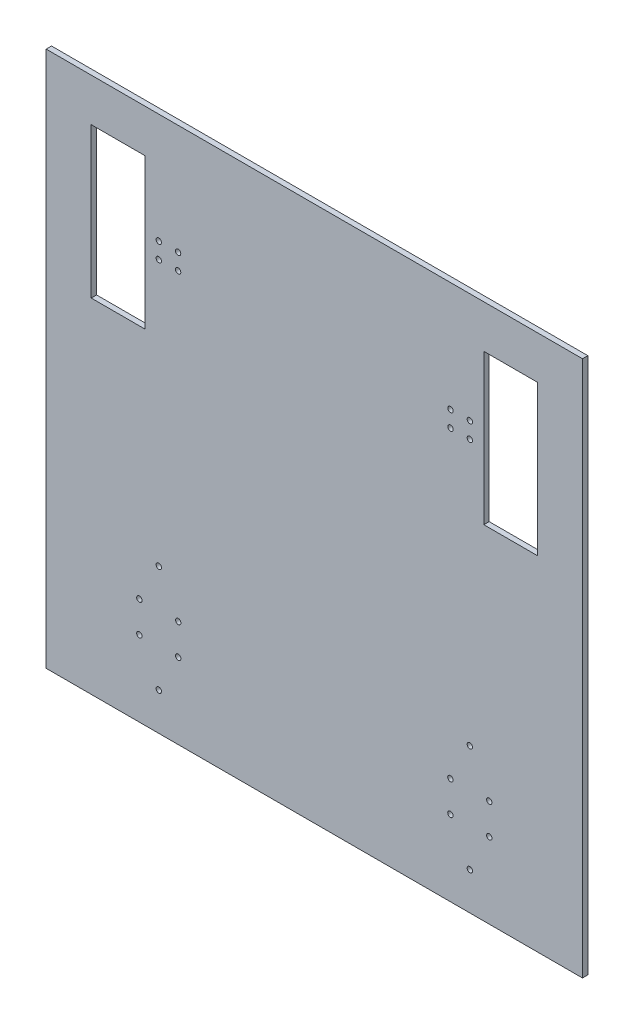
ISO-10303-21;
HEADER;
FILE_DESCRIPTION(('STEP AP214'),'2;1');
FILE_NAME('part.step','',(''),(''),'','','');
FILE_SCHEMA(('AUTOMOTIVE_DESIGN { 1 0 10303 214 1 1 1 1 }'));
ENDSEC;
DATA;
#1=APPLICATION_CONTEXT('core data for automotive mechanical design processes');
#2=APPLICATION_PROTOCOL_DEFINITION('international standard','automotive_design',2000,#1);
#3=PRODUCT_CONTEXT('',#1,'mechanical');
#4=PRODUCT('Part','Part','',(#3));
#5=PRODUCT_RELATED_PRODUCT_CATEGORY('part','',(#4));
#6=PRODUCT_DEFINITION_FORMATION('','',#4);
#7=PRODUCT_DEFINITION_CONTEXT('part definition',#1,'design');
#8=PRODUCT_DEFINITION('design','',#6,#7);
#9=PRODUCT_DEFINITION_SHAPE('','',#8);
#10=(LENGTH_UNIT() NAMED_UNIT(*) SI_UNIT(.MILLI.,.METRE.));
#11=(NAMED_UNIT(*) PLANE_ANGLE_UNIT() SI_UNIT($,.RADIAN.));
#12=(NAMED_UNIT(*) SI_UNIT($,.STERADIAN.) SOLID_ANGLE_UNIT());
#13=UNCERTAINTY_MEASURE_WITH_UNIT(LENGTH_MEASURE(1.E-05),#10,'distance_accuracy_value','');
#14=(GEOMETRIC_REPRESENTATION_CONTEXT(3) GLOBAL_UNCERTAINTY_ASSIGNED_CONTEXT((#13)) GLOBAL_UNIT_ASSIGNED_CONTEXT((#10,
#11,#12)) REPRESENTATION_CONTEXT('',''));
#15=CARTESIAN_POINT('',(0.,0.,0.));
#16=DIRECTION('',(0.,0.,1.));
#17=DIRECTION('',(1.,0.,0.));
#18=AXIS2_PLACEMENT_3D('',#15,#16,#17);
#19=CARTESIAN_POINT('',(-208.,0.,5.));
#20=DIRECTION('',(1.,0.,0.));
#21=DIRECTION('',(0.,0.,-1.));
#22=AXIS2_PLACEMENT_3D('',#19,#20,#21);
#23=PLANE('',#22);
#24=DIRECTION('',(0.,-1.,0.));
#25=VECTOR('',#24,1.);
#26=CARTESIAN_POINT('',(-208.,0.,0.));
#27=LINE('',#26,#25);
#28=CARTESIAN_POINT('',(-208.,210.,0.));
#29=VERTEX_POINT('',#28);
#30=CARTESIAN_POINT('',(-208.,70.,0.));
#31=VERTEX_POINT('',#30);
#32=EDGE_CURVE('E211',#29,#31,#27,.T.);
#33=ORIENTED_EDGE('',*,*,#32,.F.);
#34=DIRECTION('',(0.,0.,-1.));
#35=VECTOR('',#34,1.);
#36=CARTESIAN_POINT('',(-208.,210.,5.));
#37=LINE('',#36,#35);
#38=CARTESIAN_POINT('',(-208.,210.,5.));
#39=VERTEX_POINT('',#38);
#40=EDGE_CURVE('E11',#39,#29,#37,.T.);
#41=ORIENTED_EDGE('',*,*,#40,.F.);
#42=DIRECTION('',(0.,-1.,0.));
#43=VECTOR('',#42,1.);
#44=CARTESIAN_POINT('',(-208.,0.,5.));
#45=LINE('',#44,#43);
#46=CARTESIAN_POINT('',(-208.,70.,5.));
#47=VERTEX_POINT('',#46);
#48=EDGE_CURVE('E145',#39,#47,#45,.T.);
#49=ORIENTED_EDGE('',*,*,#48,.T.);
#50=DIRECTION('',(0.,0.,-1.));
#51=VECTOR('',#50,1.);
#52=CARTESIAN_POINT('',(-208.,70.,5.));
#53=LINE('',#52,#51);
#54=EDGE_CURVE('E54',#47,#31,#53,.T.);
#55=ORIENTED_EDGE('',*,*,#54,.T.);
#56=EDGE_LOOP('',(#33,#41,#49,#55));
#57=FACE_BOUND('',#56,.T.);
#58=ADVANCED_FACE('F35',(#57),#23,.T.);
#59=CARTESIAN_POINT('',(-1.16573417585641E-13,210.,5.));
#60=DIRECTION('',(0.,1.,0.));
#61=DIRECTION('',(-1.,0.,0.));
#62=AXIS2_PLACEMENT_3D('',#59,#60,#61);
#63=PLANE('',#62);
#64=DIRECTION('',(1.,0.,0.));
#65=VECTOR('',#64,1.);
#66=CARTESIAN_POINT('',(-1.16573417585641E-13,210.,0.));
#67=LINE('',#66,#65);
#68=CARTESIAN_POINT('',(-158.,210.,0.));
#69=VERTEX_POINT('',#68);
#70=EDGE_CURVE('E150',#29,#69,#67,.T.);
#71=ORIENTED_EDGE('',*,*,#70,.T.);
#72=DIRECTION('',(0.,0.,-1.));
#73=VECTOR('',#72,1.);
#74=CARTESIAN_POINT('',(-158.,210.,5.));
#75=LINE('',#74,#73);
#76=CARTESIAN_POINT('',(-158.,210.,5.));
#77=VERTEX_POINT('',#76);
#78=EDGE_CURVE('E45',#77,#69,#75,.T.);
#79=ORIENTED_EDGE('',*,*,#78,.F.);
#80=DIRECTION('',(1.,0.,0.));
#81=VECTOR('',#80,1.);
#82=CARTESIAN_POINT('',(-1.16573417585641E-13,210.,5.));
#83=LINE('',#82,#81);
#84=EDGE_CURVE('E139',#39,#77,#83,.T.);
#85=ORIENTED_EDGE('',*,*,#84,.F.);
#86=ORIENTED_EDGE('',*,*,#40,.T.);
#87=EDGE_LOOP('',(#71,#79,#85,#86));
#88=FACE_BOUND('',#87,.T.);
#89=ADVANCED_FACE('F148',(#88),#63,.F.);
#90=CARTESIAN_POINT('',(-158.,0.,5.));
#91=DIRECTION('',(1.,0.,0.));
#92=DIRECTION('',(0.,0.,-1.));
#93=AXIS2_PLACEMENT_3D('',#90,#91,#92);
#94=PLANE('',#93);
#95=DIRECTION('',(0.,-1.,0.));
#96=VECTOR('',#95,1.);
#97=CARTESIAN_POINT('',(-158.,0.,0.));
#98=LINE('',#97,#96);
#99=CARTESIAN_POINT('',(-158.,69.9999999999999,0.));
#100=VERTEX_POINT('',#99);
#101=EDGE_CURVE('E214',#69,#100,#98,.T.);
#102=ORIENTED_EDGE('',*,*,#101,.T.);
#103=DIRECTION('',(0.,0.,-1.));
#104=VECTOR('',#103,1.);
#105=CARTESIAN_POINT('',(-158.,69.9999999999999,5.));
#106=LINE('',#105,#104);
#107=CARTESIAN_POINT('',(-158.,69.9999999999999,5.));
#108=VERTEX_POINT('',#107);
#109=EDGE_CURVE('E92',#108,#100,#106,.T.);
#110=ORIENTED_EDGE('',*,*,#109,.F.);
#111=DIRECTION('',(0.,-1.,0.));
#112=VECTOR('',#111,1.);
#113=CARTESIAN_POINT('',(-158.,0.,5.));
#114=LINE('',#113,#112);
#115=EDGE_CURVE('E131',#77,#108,#114,.T.);
#116=ORIENTED_EDGE('',*,*,#115,.F.);
#117=ORIENTED_EDGE('',*,*,#78,.T.);
#118=EDGE_LOOP('',(#102,#110,#116,#117));
#119=FACE_BOUND('',#118,.T.);
#120=ADVANCED_FACE('F133',(#119),#94,.F.);
#121=CARTESIAN_POINT('',(250.,0.,5.));
#122=DIRECTION('',(-1.,0.,0.));
#123=DIRECTION('',(0.,0.,1.));
#124=AXIS2_PLACEMENT_3D('',#121,#122,#123);
#125=PLANE('',#124);
#126=DIRECTION('',(0.,1.,0.));
#127=VECTOR('',#126,1.);
#128=CARTESIAN_POINT('',(250.,0.,0.));
#129=LINE('',#128,#127);
#130=CARTESIAN_POINT('',(250.,-250.,0.));
#131=VERTEX_POINT('',#130);
#132=CARTESIAN_POINT('',(250.,250.,0.));
#133=VERTEX_POINT('',#132);
#134=EDGE_CURVE('E202',#131,#133,#129,.T.);
#135=ORIENTED_EDGE('',*,*,#134,.T.);
#136=DIRECTION('',(0.,0.,-1.));
#137=VECTOR('',#136,1.);
#138=CARTESIAN_POINT('',(250.,250.,5.));
#139=LINE('',#138,#137);
#140=CARTESIAN_POINT('',(250.,250.,5.));
#141=VERTEX_POINT('',#140);
#142=EDGE_CURVE('E164',#141,#133,#139,.T.);
#143=ORIENTED_EDGE('',*,*,#142,.F.);
#144=DIRECTION('',(0.,1.,0.));
#145=VECTOR('',#144,1.);
#146=CARTESIAN_POINT('',(250.,0.,5.));
#147=LINE('',#146,#145);
#148=CARTESIAN_POINT('',(250.,-250.,5.));
#149=VERTEX_POINT('',#148);
#150=EDGE_CURVE('E258',#149,#141,#147,.T.);
#151=ORIENTED_EDGE('',*,*,#150,.F.);
#152=DIRECTION('',(0.,0.,-1.));
#153=VECTOR('',#152,1.);
#154=CARTESIAN_POINT('',(250.,-250.,5.));
#155=LINE('',#154,#153);
#156=EDGE_CURVE('E155',#149,#131,#155,.T.);
#157=ORIENTED_EDGE('',*,*,#156,.T.);
#158=EDGE_LOOP('',(#135,#143,#151,#157));
#159=FACE_BOUND('',#158,.T.);
#160=ADVANCED_FACE('F329',(#159),#125,.F.);
#161=CARTESIAN_POINT('',(0.,250.,5.));
#162=DIRECTION('',(0.,-1.,0.));
#163=DIRECTION('',(1.,0.,0.));
#164=AXIS2_PLACEMENT_3D('',#161,#162,#163);
#165=PLANE('',#164);
#166=DIRECTION('',(-1.,0.,0.));
#167=VECTOR('',#166,1.);
#168=CARTESIAN_POINT('',(0.,250.,0.));
#169=LINE('',#168,#167);
#170=CARTESIAN_POINT('',(-250.,250.,0.));
#171=VERTEX_POINT('',#170);
#172=EDGE_CURVE('E205',#133,#171,#169,.T.);
#173=ORIENTED_EDGE('',*,*,#172,.T.);
#174=DIRECTION('',(0.,0.,-1.));
#175=VECTOR('',#174,1.);
#176=CARTESIAN_POINT('',(-250.,250.,5.));
#177=LINE('',#176,#175);
#178=CARTESIAN_POINT('',(-250.,250.,5.));
#179=VERTEX_POINT('',#178);
#180=EDGE_CURVE('E161',#179,#171,#177,.T.);
#181=ORIENTED_EDGE('',*,*,#180,.F.);
#182=DIRECTION('',(-1.,0.,0.));
#183=VECTOR('',#182,1.);
#184=CARTESIAN_POINT('',(0.,250.,5.));
#185=LINE('',#184,#183);
#186=EDGE_CURVE('E261',#141,#179,#185,.T.);
#187=ORIENTED_EDGE('',*,*,#186,.F.);
#188=ORIENTED_EDGE('',*,*,#142,.T.);
#189=EDGE_LOOP('',(#173,#181,#187,#188));
#190=FACE_BOUND('',#189,.T.);
#191=ADVANCED_FACE('F325',(#190),#165,.F.);
#192=CARTESIAN_POINT('',(-250.,0.,5.));
#193=DIRECTION('',(1.,0.,0.));
#194=DIRECTION('',(0.,0.,-1.));
#195=AXIS2_PLACEMENT_3D('',#192,#193,#194);
#196=PLANE('',#195);
#197=DIRECTION('',(0.,-1.,0.));
#198=VECTOR('',#197,1.);
#199=CARTESIAN_POINT('',(-250.,0.,0.));
#200=LINE('',#199,#198);
#201=CARTESIAN_POINT('',(-250.,-250.,0.));
#202=VERTEX_POINT('',#201);
#203=EDGE_CURVE('E207',#171,#202,#200,.T.);
#204=ORIENTED_EDGE('',*,*,#203,.T.);
#205=DIRECTION('',(0.,0.,-1.));
#206=VECTOR('',#205,1.);
#207=CARTESIAN_POINT('',(-250.,-250.,5.));
#208=LINE('',#207,#206);
#209=CARTESIAN_POINT('',(-250.,-250.,5.));
#210=VERTEX_POINT('',#209);
#211=EDGE_CURVE('E158',#210,#202,#208,.T.);
#212=ORIENTED_EDGE('',*,*,#211,.F.);
#213=DIRECTION('',(0.,-1.,0.));
#214=VECTOR('',#213,1.);
#215=CARTESIAN_POINT('',(-250.,0.,5.));
#216=LINE('',#215,#214);
#217=EDGE_CURVE('E263',#179,#210,#216,.T.);
#218=ORIENTED_EDGE('',*,*,#217,.F.);
#219=ORIENTED_EDGE('',*,*,#180,.T.);
#220=EDGE_LOOP('',(#204,#212,#218,#219));
#221=FACE_BOUND('',#220,.T.);
#222=ADVANCED_FACE('F322',(#221),#196,.F.);
#223=CARTESIAN_POINT('',(158.,0.,5.));
#224=DIRECTION('',(1.,0.,0.));
#225=DIRECTION('',(0.,0.,-1.));
#226=AXIS2_PLACEMENT_3D('',#223,#224,#225);
#227=PLANE('',#226);
#228=DIRECTION('',(0.,-1.,0.));
#229=VECTOR('',#228,1.);
#230=CARTESIAN_POINT('',(158.,0.,0.));
#231=LINE('',#230,#229);
#232=CARTESIAN_POINT('',(158.,210.,0.));
#233=VERTEX_POINT('',#232);
#234=CARTESIAN_POINT('',(158.,69.9999999999999,0.));
#235=VERTEX_POINT('',#234);
#236=EDGE_CURVE('E186',#233,#235,#231,.T.);
#237=ORIENTED_EDGE('',*,*,#236,.F.);
#238=DIRECTION('',(0.,0.,-1.));
#239=VECTOR('',#238,1.);
#240=CARTESIAN_POINT('',(158.,210.,5.));
#241=LINE('',#240,#239);
#242=CARTESIAN_POINT('',(158.,210.,5.));
#243=VERTEX_POINT('',#242);
#244=EDGE_CURVE('E39',#243,#233,#241,.T.);
#245=ORIENTED_EDGE('',*,*,#244,.F.);
#246=DIRECTION('',(0.,-1.,0.));
#247=VECTOR('',#246,1.);
#248=CARTESIAN_POINT('',(158.,0.,5.));
#249=LINE('',#248,#247);
#250=CARTESIAN_POINT('',(158.,69.9999999999999,5.));
#251=VERTEX_POINT('',#250);
#252=EDGE_CURVE('E250',#243,#251,#249,.T.);
#253=ORIENTED_EDGE('',*,*,#252,.T.);
#254=DIRECTION('',(0.,0.,-1.));
#255=VECTOR('',#254,1.);
#256=CARTESIAN_POINT('',(158.,69.9999999999999,5.));
#257=LINE('',#256,#255);
#258=EDGE_CURVE('E167',#251,#235,#257,.T.);
#259=ORIENTED_EDGE('',*,*,#258,.T.);
#260=EDGE_LOOP('',(#237,#245,#253,#259));
#261=FACE_BOUND('',#260,.T.);
#262=ADVANCED_FACE('F187',(#261),#227,.T.);
#263=CARTESIAN_POINT('',(1.16573417585641E-13,210.,5.));
#264=DIRECTION('',(0.,-1.,0.));
#265=DIRECTION('',(1.,0.,0.));
#266=AXIS2_PLACEMENT_3D('',#263,#264,#265);
#267=PLANE('',#266);
#268=DIRECTION('',(-1.,0.,0.));
#269=VECTOR('',#268,1.);
#270=CARTESIAN_POINT('',(1.16573417585641E-13,210.,0.));
#271=LINE('',#270,#269);
#272=CARTESIAN_POINT('',(208.,210.,0.));
#273=VERTEX_POINT('',#272);
#274=EDGE_CURVE('E182',#273,#233,#271,.T.);
#275=ORIENTED_EDGE('',*,*,#274,.F.);
#276=DIRECTION('',(0.,0.,-1.));
#277=VECTOR('',#276,1.);
#278=CARTESIAN_POINT('',(208.,210.,5.));
#279=LINE('',#278,#277);
#280=CARTESIAN_POINT('',(208.,210.,5.));
#281=VERTEX_POINT('',#280);
#282=EDGE_CURVE('E172',#281,#273,#279,.T.);
#283=ORIENTED_EDGE('',*,*,#282,.F.);
#284=DIRECTION('',(-1.,0.,0.));
#285=VECTOR('',#284,1.);
#286=CARTESIAN_POINT('',(1.16573417585641E-13,210.,5.));
#287=LINE('',#286,#285);
#288=EDGE_CURVE('E184',#281,#243,#287,.T.);
#289=ORIENTED_EDGE('',*,*,#288,.T.);
#290=ORIENTED_EDGE('',*,*,#244,.T.);
#291=EDGE_LOOP('',(#275,#283,#289,#290));
#292=FACE_BOUND('',#291,.T.);
#293=ADVANCED_FACE('F180',(#292),#267,.T.);
#294=CARTESIAN_POINT('',(208.,0.,5.));
#295=DIRECTION('',(1.,0.,0.));
#296=DIRECTION('',(0.,0.,-1.));
#297=AXIS2_PLACEMENT_3D('',#294,#295,#296);
#298=PLANE('',#297);
#299=DIRECTION('',(0.,-1.,0.));
#300=VECTOR('',#299,1.);
#301=CARTESIAN_POINT('',(208.,0.,0.));
#302=LINE('',#301,#300);
#303=CARTESIAN_POINT('',(208.,70.,0.));
#304=VERTEX_POINT('',#303);
#305=EDGE_CURVE('E195',#273,#304,#302,.T.);
#306=ORIENTED_EDGE('',*,*,#305,.T.);
#307=DIRECTION('',(0.,0.,-1.));
#308=VECTOR('',#307,1.);
#309=CARTESIAN_POINT('',(208.,70.,5.));
#310=LINE('',#309,#308);
#311=CARTESIAN_POINT('',(208.,70.,5.));
#312=VERTEX_POINT('',#311);
#313=EDGE_CURVE('E169',#312,#304,#310,.T.);
#314=ORIENTED_EDGE('',*,*,#313,.F.);
#315=DIRECTION('',(0.,-1.,0.));
#316=VECTOR('',#315,1.);
#317=CARTESIAN_POINT('',(208.,0.,5.));
#318=LINE('',#317,#316);
#319=EDGE_CURVE('E253',#281,#312,#318,.T.);
#320=ORIENTED_EDGE('',*,*,#319,.F.);
#321=ORIENTED_EDGE('',*,*,#282,.T.);
#322=EDGE_LOOP('',(#306,#314,#320,#321));
#323=FACE_BOUND('',#322,.T.);
#324=ADVANCED_FACE('F334',(#323),#298,.F.);
#325=CARTESIAN_POINT('',(-145.,132.5,5.));
#326=DIRECTION('',(0.,0.,-1.));
#327=DIRECTION('',(-1.,0.,0.));
#328=AXIS2_PLACEMENT_3D('',#325,#326,#327);
#329=CYLINDRICAL_SURFACE('',#328,2.5);
#330=CARTESIAN_POINT('',(-145.,132.5,5.));
#331=DIRECTION('',(0.,0.,1.));
#332=DIRECTION('',(1.,0.,0.));
#333=AXIS2_PLACEMENT_3D('',#330,#331,#332);
#334=CIRCLE('',#333,2.5);
#335=CARTESIAN_POINT('',(-142.5,132.5,5.));
#336=VERTEX_POINT('',#335);
#337=EDGE_CURVE('E269',#336,#336,#334,.F.);
#338=ORIENTED_EDGE('',*,*,#337,.F.);
#339=EDGE_LOOP('',(#338));
#340=FACE_BOUND('',#339,.T.);
#341=CARTESIAN_POINT('',(-145.,132.5,0.));
#342=DIRECTION('',(0.,0.,1.));
#343=DIRECTION('',(1.,0.,0.));
#344=AXIS2_PLACEMENT_3D('',#341,#342,#343);
#345=CIRCLE('',#344,2.5);
#346=CARTESIAN_POINT('',(-142.5,132.5,0.));
#347=VERTEX_POINT('',#346);
#348=EDGE_CURVE('E219',#347,#347,#345,.F.);
#349=ORIENTED_EDGE('',*,*,#348,.T.);
#350=EDGE_LOOP('',(#349));
#351=FACE_BOUND('',#350,.T.);
#352=ADVANCED_FACE('F337',(#340,#351),#329,.F.);
#353=CARTESIAN_POINT('',(0.,69.9999999999998,5.));
#354=DIRECTION('',(0.,1.,0.));
#355=DIRECTION('',(-1.,0.,0.));
#356=AXIS2_PLACEMENT_3D('',#353,#354,#355);
#357=PLANE('',#356);
#358=DIRECTION('',(1.,0.,0.));
#359=VECTOR('',#358,1.);
#360=CARTESIAN_POINT('',(0.,69.9999999999998,0.));
#361=LINE('',#360,#359);
#362=EDGE_CURVE('E216',#31,#100,#361,.T.);
#363=ORIENTED_EDGE('',*,*,#362,.F.);
#364=ORIENTED_EDGE('',*,*,#54,.F.);
#365=DIRECTION('',(1.,0.,0.));
#366=VECTOR('',#365,1.);
#367=CARTESIAN_POINT('',(0.,69.9999999999998,5.));
#368=LINE('',#367,#366);
#369=EDGE_CURVE('E138',#47,#108,#368,.T.);
#370=ORIENTED_EDGE('',*,*,#369,.T.);
#371=ORIENTED_EDGE('',*,*,#109,.T.);
#372=EDGE_LOOP('',(#363,#364,#370,#371));
#373=FACE_BOUND('',#372,.T.);
#374=ADVANCED_FACE('F320',(#373),#357,.T.);
#375=CARTESIAN_POINT('',(0.,-250.,5.));
#376=DIRECTION('',(0.,1.,0.));
#377=DIRECTION('',(-1.,0.,0.));
#378=AXIS2_PLACEMENT_3D('',#375,#376,#377);
#379=PLANE('',#378);
#380=DIRECTION('',(1.,0.,0.));
#381=VECTOR('',#380,1.);
#382=CARTESIAN_POINT('',(0.,-250.,0.));
#383=LINE('',#382,#381);
#384=EDGE_CURVE('E209',#202,#131,#383,.T.);
#385=ORIENTED_EDGE('',*,*,#384,.T.);
#386=ORIENTED_EDGE('',*,*,#156,.F.);
#387=DIRECTION('',(1.,0.,0.));
#388=VECTOR('',#387,1.);
#389=CARTESIAN_POINT('',(0.,-250.,5.));
#390=LINE('',#389,#388);
#391=EDGE_CURVE('E265',#210,#149,#390,.T.);
#392=ORIENTED_EDGE('',*,*,#391,.F.);
#393=ORIENTED_EDGE('',*,*,#211,.T.);
#394=EDGE_LOOP('',(#385,#386,#392,#393));
#395=FACE_BOUND('',#394,.T.);
#396=ADVANCED_FACE('F306',(#395),#379,.F.);
#397=CARTESIAN_POINT('',(0.,69.9999999999998,5.));
#398=DIRECTION('',(0.,-1.,0.));
#399=DIRECTION('',(1.,0.,0.));
#400=AXIS2_PLACEMENT_3D('',#397,#398,#399);
#401=PLANE('',#400);
#402=DIRECTION('',(-1.,0.,0.));
#403=VECTOR('',#402,1.);
#404=CARTESIAN_POINT('',(0.,69.9999999999998,0.));
#405=LINE('',#404,#403);
#406=EDGE_CURVE('E197',#304,#235,#405,.T.);
#407=ORIENTED_EDGE('',*,*,#406,.T.);
#408=ORIENTED_EDGE('',*,*,#258,.F.);
#409=DIRECTION('',(-1.,0.,0.));
#410=VECTOR('',#409,1.);
#411=CARTESIAN_POINT('',(0.,69.9999999999998,5.));
#412=LINE('',#411,#410);
#413=EDGE_CURVE('E256',#312,#251,#412,.T.);
#414=ORIENTED_EDGE('',*,*,#413,.F.);
#415=ORIENTED_EDGE('',*,*,#313,.T.);
#416=EDGE_LOOP('',(#407,#408,#414,#415));
#417=FACE_BOUND('',#416,.T.);
#418=ADVANCED_FACE('F296',(#417),#401,.F.);
#419=CARTESIAN_POINT('',(127.,147.5,5.));
#420=DIRECTION('',(0.,0.,-1.));
#421=DIRECTION('',(-1.,0.,0.));
#422=AXIS2_PLACEMENT_3D('',#419,#420,#421);
#423=CYLINDRICAL_SURFACE('',#422,2.5);
#424=CARTESIAN_POINT('',(127.,147.5,5.));
#425=DIRECTION('',(0.,0.,1.));
#426=DIRECTION('',(1.,0.,0.));
#427=AXIS2_PLACEMENT_3D('',#424,#425,#426);
#428=CIRCLE('',#427,2.5);
#429=CARTESIAN_POINT('',(129.5,147.5,5.));
#430=VERTEX_POINT('',#429);
#431=EDGE_CURVE('E247',#430,#430,#428,.T.);
#432=ORIENTED_EDGE('',*,*,#431,.T.);
#433=EDGE_LOOP('',(#432));
#434=FACE_BOUND('',#433,.T.);
#435=CARTESIAN_POINT('',(127.,147.5,0.));
#436=DIRECTION('',(0.,0.,1.));
#437=DIRECTION('',(1.,0.,0.));
#438=AXIS2_PLACEMENT_3D('',#435,#436,#437);
#439=CIRCLE('',#438,2.5);
#440=CARTESIAN_POINT('',(129.5,147.5,0.));
#441=VERTEX_POINT('',#440);
#442=EDGE_CURVE('E191',#441,#441,#439,.T.);
#443=ORIENTED_EDGE('',*,*,#442,.F.);
#444=EDGE_LOOP('',(#443));
#445=FACE_BOUND('',#444,.T.);
#446=ADVANCED_FACE('F293',(#434,#445),#423,.F.);
#447=CARTESIAN_POINT('',(127.,132.5,5.));
#448=DIRECTION('',(0.,0.,-1.));
#449=DIRECTION('',(-1.,0.,0.));
#450=AXIS2_PLACEMENT_3D('',#447,#448,#449);
#451=CYLINDRICAL_SURFACE('',#450,2.5);
#452=CARTESIAN_POINT('',(127.,132.5,5.));
#453=DIRECTION('',(0.,0.,1.));
#454=DIRECTION('',(1.,0.,0.));
#455=AXIS2_PLACEMENT_3D('',#452,#453,#454);
#456=CIRCLE('',#455,2.5);
#457=CARTESIAN_POINT('',(129.5,132.5,5.));
#458=VERTEX_POINT('',#457);
#459=EDGE_CURVE('E244',#458,#458,#456,.T.);
#460=ORIENTED_EDGE('',*,*,#459,.T.);
#461=EDGE_LOOP('',(#460));
#462=FACE_BOUND('',#461,.T.);
#463=CARTESIAN_POINT('',(127.,132.5,0.));
#464=DIRECTION('',(0.,0.,1.));
#465=DIRECTION('',(1.,0.,0.));
#466=AXIS2_PLACEMENT_3D('',#463,#464,#465);
#467=CIRCLE('',#466,2.5);
#468=CARTESIAN_POINT('',(129.5,132.5,0.));
#469=VERTEX_POINT('',#468);
#470=EDGE_CURVE('E287',#469,#469,#467,.T.);
#471=ORIENTED_EDGE('',*,*,#470,.F.);
#472=EDGE_LOOP('',(#471));
#473=FACE_BOUND('',#472,.T.);
#474=ADVANCED_FACE('F295',(#462,#473),#451,.F.);
#475=CARTESIAN_POINT('',(145.,132.5,5.));
#476=DIRECTION('',(0.,0.,-1.));
#477=DIRECTION('',(-1.,0.,0.));
#478=AXIS2_PLACEMENT_3D('',#475,#476,#477);
#479=CYLINDRICAL_SURFACE('',#478,2.5);
#480=CARTESIAN_POINT('',(145.,132.5,5.));
#481=DIRECTION('',(0.,0.,1.));
#482=DIRECTION('',(1.,0.,0.));
#483=AXIS2_PLACEMENT_3D('',#480,#481,#482);
#484=CIRCLE('',#483,2.5);
#485=CARTESIAN_POINT('',(147.5,132.5,5.));
#486=VERTEX_POINT('',#485);
#487=EDGE_CURVE('E241',#486,#486,#484,.T.);
#488=ORIENTED_EDGE('',*,*,#487,.T.);
#489=EDGE_LOOP('',(#488));
#490=FACE_BOUND('',#489,.T.);
#491=CARTESIAN_POINT('',(145.,132.5,0.));
#492=DIRECTION('',(0.,0.,1.));
#493=DIRECTION('',(1.,0.,0.));
#494=AXIS2_PLACEMENT_3D('',#491,#492,#493);
#495=CIRCLE('',#494,2.5);
#496=CARTESIAN_POINT('',(147.5,132.5,0.));
#497=VERTEX_POINT('',#496);
#498=EDGE_CURVE('E284',#497,#497,#495,.T.);
#499=ORIENTED_EDGE('',*,*,#498,.F.);
#500=EDGE_LOOP('',(#499));
#501=FACE_BOUND('',#500,.T.);
#502=ADVANCED_FACE('F303',(#490,#501),#479,.F.);
#503=CARTESIAN_POINT('',(145.,147.5,5.));
#504=DIRECTION('',(0.,0.,-1.));
#505=DIRECTION('',(-1.,0.,0.));
#506=AXIS2_PLACEMENT_3D('',#503,#504,#505);
#507=CYLINDRICAL_SURFACE('',#506,2.5);
#508=CARTESIAN_POINT('',(145.,147.5,5.));
#509=DIRECTION('',(0.,0.,1.));
#510=DIRECTION('',(1.,0.,0.));
#511=AXIS2_PLACEMENT_3D('',#508,#509,#510);
#512=CIRCLE('',#511,2.5);
#513=CARTESIAN_POINT('',(147.5,147.5,5.));
#514=VERTEX_POINT('',#513);
#515=EDGE_CURVE('E233',#514,#514,#512,.T.);
#516=ORIENTED_EDGE('',*,*,#515,.T.);
#517=EDGE_LOOP('',(#516));
#518=FACE_BOUND('',#517,.T.);
#519=CARTESIAN_POINT('',(145.,147.5,0.));
#520=DIRECTION('',(0.,0.,1.));
#521=DIRECTION('',(1.,0.,0.));
#522=AXIS2_PLACEMENT_3D('',#519,#520,#521);
#523=CIRCLE('',#522,2.5);
#524=CARTESIAN_POINT('',(147.5,147.5,0.));
#525=VERTEX_POINT('',#524);
#526=EDGE_CURVE('E281',#525,#525,#523,.T.);
#527=ORIENTED_EDGE('',*,*,#526,.F.);
#528=EDGE_LOOP('',(#527));
#529=FACE_BOUND('',#528,.T.);
#530=ADVANCED_FACE('F392',(#518,#529),#507,.F.);
#531=CARTESIAN_POINT('',(-145.,147.5,5.));
#532=DIRECTION('',(0.,0.,-1.));
#533=DIRECTION('',(-1.,0.,0.));
#534=AXIS2_PLACEMENT_3D('',#531,#532,#533);
#535=CYLINDRICAL_SURFACE('',#534,2.5);
#536=CARTESIAN_POINT('',(-145.,147.5,5.));
#537=DIRECTION('',(0.,0.,1.));
#538=DIRECTION('',(1.,0.,0.));
#539=AXIS2_PLACEMENT_3D('',#536,#537,#538);
#540=CIRCLE('',#539,2.5);
#541=CARTESIAN_POINT('',(-142.5,147.5,5.));
#542=VERTEX_POINT('',#541);
#543=EDGE_CURVE('E228',#542,#542,#540,.F.);
#544=ORIENTED_EDGE('',*,*,#543,.F.);
#545=EDGE_LOOP('',(#544));
#546=FACE_BOUND('',#545,.T.);
#547=CARTESIAN_POINT('',(-145.,147.5,0.));
#548=DIRECTION('',(0.,0.,1.));
#549=DIRECTION('',(1.,0.,0.));
#550=AXIS2_PLACEMENT_3D('',#547,#548,#549);
#551=CIRCLE('',#550,2.5);
#552=CARTESIAN_POINT('',(-142.5,147.5,0.));
#553=VERTEX_POINT('',#552);
#554=EDGE_CURVE('E277',#553,#553,#551,.F.);
#555=ORIENTED_EDGE('',*,*,#554,.T.);
#556=EDGE_LOOP('',(#555));
#557=FACE_BOUND('',#556,.T.);
#558=ADVANCED_FACE('F402',(#546,#557),#535,.F.);
#559=CARTESIAN_POINT('',(-127.,132.5,5.));
#560=DIRECTION('',(0.,0.,-1.));
#561=DIRECTION('',(-1.,0.,0.));
#562=AXIS2_PLACEMENT_3D('',#559,#560,#561);
#563=CYLINDRICAL_SURFACE('',#562,2.5);
#564=CARTESIAN_POINT('',(-127.,132.5,5.));
#565=DIRECTION('',(0.,0.,1.));
#566=DIRECTION('',(1.,0.,0.));
#567=AXIS2_PLACEMENT_3D('',#564,#565,#566);
#568=CIRCLE('',#567,2.5);
#569=CARTESIAN_POINT('',(-124.5,132.5,5.));
#570=VERTEX_POINT('',#569);
#571=EDGE_CURVE('E224',#570,#570,#568,.F.);
#572=ORIENTED_EDGE('',*,*,#571,.F.);
#573=EDGE_LOOP('',(#572));
#574=FACE_BOUND('',#573,.T.);
#575=CARTESIAN_POINT('',(-127.,132.5,0.));
#576=DIRECTION('',(0.,0.,1.));
#577=DIRECTION('',(1.,0.,0.));
#578=AXIS2_PLACEMENT_3D('',#575,#576,#577);
#579=CIRCLE('',#578,2.5);
#580=CARTESIAN_POINT('',(-124.5,132.5,0.));
#581=VERTEX_POINT('',#580);
#582=EDGE_CURVE('E274',#581,#581,#579,.F.);
#583=ORIENTED_EDGE('',*,*,#582,.T.);
#584=EDGE_LOOP('',(#583));
#585=FACE_BOUND('',#584,.T.);
#586=ADVANCED_FACE('F37',(#574,#585),#563,.F.);
#587=CARTESIAN_POINT('',(-127.,147.5,5.));
#588=DIRECTION('',(0.,0.,-1.));
#589=DIRECTION('',(-1.,0.,0.));
#590=AXIS2_PLACEMENT_3D('',#587,#588,#589);
#591=CYLINDRICAL_SURFACE('',#590,2.5);
#592=CARTESIAN_POINT('',(-127.,147.5,5.));
#593=DIRECTION('',(0.,0.,1.));
#594=DIRECTION('',(1.,0.,0.));
#595=AXIS2_PLACEMENT_3D('',#592,#593,#594);
#596=CIRCLE('',#595,2.5);
#597=CARTESIAN_POINT('',(-124.5,147.5,5.));
#598=VERTEX_POINT('',#597);
#599=EDGE_CURVE('E170',#598,#598,#596,.F.);
#600=ORIENTED_EDGE('',*,*,#599,.F.);
#601=EDGE_LOOP('',(#600));
#602=FACE_BOUND('',#601,.T.);
#603=CARTESIAN_POINT('',(-127.,147.5,0.));
#604=DIRECTION('',(0.,0.,1.));
#605=DIRECTION('',(1.,0.,0.));
#606=AXIS2_PLACEMENT_3D('',#603,#604,#605);
#607=CIRCLE('',#606,2.5);
#608=CARTESIAN_POINT('',(-124.5,147.5,0.));
#609=VERTEX_POINT('',#608);
#610=EDGE_CURVE('E222',#609,#609,#607,.F.);
#611=ORIENTED_EDGE('',*,*,#610,.T.);
#612=EDGE_LOOP('',(#611));
#613=FACE_BOUND('',#612,.T.);
#614=ADVANCED_FACE('F420',(#602,#613),#591,.F.);
#615=CARTESIAN_POINT('',(0.,0.,5.));
#616=DIRECTION('',(0.,0.,1.));
#617=DIRECTION('',(1.,0.,0.));
#618=AXIS2_PLACEMENT_3D('',#615,#616,#617);
#619=PLANE('',#618);
#620=CARTESIAN_POINT('',(-145.,-215.,5.));
#621=DIRECTION('',(0.,0.,1.));
#622=DIRECTION('',(1.,0.,0.));
#623=AXIS2_PLACEMENT_3D('',#620,#621,#622);
#624=CIRCLE('',#623,2.5);
#625=CARTESIAN_POINT('',(-142.5,-215.,5.));
#626=VERTEX_POINT('',#625);
#627=EDGE_CURVE('E619',#626,#626,#624,.T.);
#628=ORIENTED_EDGE('',*,*,#627,.F.);
#629=EDGE_LOOP('',(#628));
#630=FACE_BOUND('',#629,.T.);
#631=CARTESIAN_POINT('',(-145.,-115.,5.));
#632=DIRECTION('',(0.,0.,1.));
#633=DIRECTION('',(1.,0.,0.));
#634=AXIS2_PLACEMENT_3D('',#631,#632,#633);
#635=CIRCLE('',#634,2.5);
#636=CARTESIAN_POINT('',(-142.5,-115.,5.));
#637=VERTEX_POINT('',#636);
#638=EDGE_CURVE('E623',#637,#637,#635,.T.);
#639=ORIENTED_EDGE('',*,*,#638,.F.);
#640=EDGE_LOOP('',(#639));
#641=FACE_BOUND('',#640,.T.);
#642=CARTESIAN_POINT('',(-163.125,-179.4,5.));
#643=DIRECTION('',(0.,0.,1.));
#644=DIRECTION('',(1.,0.,0.));
#645=AXIS2_PLACEMENT_3D('',#642,#643,#644);
#646=CIRCLE('',#645,2.5);
#647=CARTESIAN_POINT('',(-160.625,-179.4,5.));
#648=VERTEX_POINT('',#647);
#649=EDGE_CURVE('E765',#648,#648,#646,.T.);
#650=ORIENTED_EDGE('',*,*,#649,.F.);
#651=EDGE_LOOP('',(#650));
#652=FACE_BOUND('',#651,.T.);
#653=CARTESIAN_POINT('',(-126.875,-179.4,5.));
#654=DIRECTION('',(0.,0.,1.));
#655=DIRECTION('',(1.,0.,0.));
#656=AXIS2_PLACEMENT_3D('',#653,#654,#655);
#657=CIRCLE('',#656,2.5);
#658=CARTESIAN_POINT('',(-124.375,-179.4,5.));
#659=VERTEX_POINT('',#658);
#660=EDGE_CURVE('E644',#659,#659,#657,.T.);
#661=ORIENTED_EDGE('',*,*,#660,.F.);
#662=EDGE_LOOP('',(#661));
#663=FACE_BOUND('',#662,.T.);
#664=CARTESIAN_POINT('',(-126.875,-150.6,5.));
#665=DIRECTION('',(0.,0.,1.));
#666=DIRECTION('',(1.,0.,0.));
#667=AXIS2_PLACEMENT_3D('',#664,#665,#666);
#668=CIRCLE('',#667,2.5);
#669=CARTESIAN_POINT('',(-124.375,-150.6,5.));
#670=VERTEX_POINT('',#669);
#671=EDGE_CURVE('E638',#670,#670,#668,.T.);
#672=ORIENTED_EDGE('',*,*,#671,.F.);
#673=EDGE_LOOP('',(#672));
#674=FACE_BOUND('',#673,.T.);
#675=CARTESIAN_POINT('',(-163.125,-150.6,5.));
#676=DIRECTION('',(0.,0.,1.));
#677=DIRECTION('',(1.,0.,0.));
#678=AXIS2_PLACEMENT_3D('',#675,#676,#677);
#679=CIRCLE('',#678,2.5);
#680=CARTESIAN_POINT('',(-160.625,-150.6,5.));
#681=VERTEX_POINT('',#680);
#682=EDGE_CURVE('E632',#681,#681,#679,.T.);
#683=ORIENTED_EDGE('',*,*,#682,.F.);
#684=EDGE_LOOP('',(#683));
#685=FACE_BOUND('',#684,.T.);
#686=CARTESIAN_POINT('',(163.125,-150.6,5.));
#687=DIRECTION('',(0.,0.,1.));
#688=DIRECTION('',(-1.,0.,0.));
#689=AXIS2_PLACEMENT_3D('',#686,#687,#688);
#690=CIRCLE('',#689,2.5);
#691=CARTESIAN_POINT('',(160.625,-150.6,5.));
#692=VERTEX_POINT('',#691);
#693=EDGE_CURVE('E664',#692,#692,#690,.T.);
#694=ORIENTED_EDGE('',*,*,#693,.F.);
#695=EDGE_LOOP('',(#694));
#696=FACE_BOUND('',#695,.T.);
#697=CARTESIAN_POINT('',(126.875,-150.6,5.));
#698=DIRECTION('',(0.,0.,1.));
#699=DIRECTION('',(-1.,0.,0.));
#700=AXIS2_PLACEMENT_3D('',#697,#698,#699);
#701=CIRCLE('',#700,2.5);
#702=CARTESIAN_POINT('',(124.375,-150.6,5.));
#703=VERTEX_POINT('',#702);
#704=EDGE_CURVE('E658',#703,#703,#701,.T.);
#705=ORIENTED_EDGE('',*,*,#704,.F.);
#706=EDGE_LOOP('',(#705));
#707=FACE_BOUND('',#706,.T.);
#708=CARTESIAN_POINT('',(126.875,-179.4,5.));
#709=DIRECTION('',(0.,0.,1.));
#710=DIRECTION('',(-1.,0.,0.));
#711=AXIS2_PLACEMENT_3D('',#708,#709,#710);
#712=CIRCLE('',#711,2.5);
#713=CARTESIAN_POINT('',(124.375,-179.4,5.));
#714=VERTEX_POINT('',#713);
#715=EDGE_CURVE('E650',#714,#714,#712,.T.);
#716=ORIENTED_EDGE('',*,*,#715,.F.);
#717=EDGE_LOOP('',(#716));
#718=FACE_BOUND('',#717,.T.);
#719=CARTESIAN_POINT('',(163.125,-179.4,5.));
#720=DIRECTION('',(0.,0.,1.));
#721=DIRECTION('',(-1.,0.,0.));
#722=AXIS2_PLACEMENT_3D('',#719,#720,#721);
#723=CIRCLE('',#722,2.5);
#724=CARTESIAN_POINT('',(160.625,-179.4,5.));
#725=VERTEX_POINT('',#724);
#726=EDGE_CURVE('E657',#725,#725,#723,.T.);
#727=ORIENTED_EDGE('',*,*,#726,.F.);
#728=EDGE_LOOP('',(#727));
#729=FACE_BOUND('',#728,.T.);
#730=CARTESIAN_POINT('',(145.,-115.,5.));
#731=DIRECTION('',(0.,0.,1.));
#732=DIRECTION('',(-1.,0.,0.));
#733=AXIS2_PLACEMENT_3D('',#730,#731,#732);
#734=CIRCLE('',#733,2.5);
#735=CARTESIAN_POINT('',(142.5,-115.,5.));
#736=VERTEX_POINT('',#735);
#737=EDGE_CURVE('E675',#736,#736,#734,.T.);
#738=ORIENTED_EDGE('',*,*,#737,.F.);
#739=EDGE_LOOP('',(#738));
#740=FACE_BOUND('',#739,.T.);
#741=CARTESIAN_POINT('',(145.,-215.,5.));
#742=DIRECTION('',(0.,0.,1.));
#743=DIRECTION('',(-1.,0.,0.));
#744=AXIS2_PLACEMENT_3D('',#741,#742,#743);
#745=CIRCLE('',#744,2.5);
#746=CARTESIAN_POINT('',(142.5,-215.,5.));
#747=VERTEX_POINT('',#746);
#748=EDGE_CURVE('E669',#747,#747,#745,.T.);
#749=ORIENTED_EDGE('',*,*,#748,.F.);
#750=EDGE_LOOP('',(#749));
#751=FACE_BOUND('',#750,.T.);
#752=ORIENTED_EDGE('',*,*,#571,.T.);
#753=EDGE_LOOP('',(#752));
#754=FACE_BOUND('',#753,.T.);
#755=ORIENTED_EDGE('',*,*,#543,.T.);
#756=EDGE_LOOP('',(#755));
#757=FACE_BOUND('',#756,.T.);
#758=ORIENTED_EDGE('',*,*,#515,.F.);
#759=EDGE_LOOP('',(#758));
#760=FACE_BOUND('',#759,.T.);
#761=ORIENTED_EDGE('',*,*,#487,.F.);
#762=EDGE_LOOP('',(#761));
#763=FACE_BOUND('',#762,.T.);
#764=ORIENTED_EDGE('',*,*,#459,.F.);
#765=EDGE_LOOP('',(#764));
#766=FACE_BOUND('',#765,.T.);
#767=ORIENTED_EDGE('',*,*,#431,.F.);
#768=EDGE_LOOP('',(#767));
#769=FACE_BOUND('',#768,.T.);
#770=ORIENTED_EDGE('',*,*,#252,.F.);
#771=ORIENTED_EDGE('',*,*,#288,.F.);
#772=ORIENTED_EDGE('',*,*,#319,.T.);
#773=ORIENTED_EDGE('',*,*,#413,.T.);
#774=EDGE_LOOP('',(#770,#771,#772,#773));
#775=FACE_BOUND('',#774,.T.);
#776=ORIENTED_EDGE('',*,*,#150,.T.);
#777=ORIENTED_EDGE('',*,*,#186,.T.);
#778=ORIENTED_EDGE('',*,*,#217,.T.);
#779=ORIENTED_EDGE('',*,*,#391,.T.);
#780=EDGE_LOOP('',(#776,#777,#778,#779));
#781=FACE_BOUND('',#780,.T.);
#782=ORIENTED_EDGE('',*,*,#48,.F.);
#783=ORIENTED_EDGE('',*,*,#84,.T.);
#784=ORIENTED_EDGE('',*,*,#115,.T.);
#785=ORIENTED_EDGE('',*,*,#369,.F.);
#786=EDGE_LOOP('',(#782,#783,#784,#785));
#787=FACE_BOUND('',#786,.T.);
#788=ORIENTED_EDGE('',*,*,#337,.T.);
#789=EDGE_LOOP('',(#788));
#790=FACE_BOUND('',#789,.T.);
#791=ORIENTED_EDGE('',*,*,#599,.T.);
#792=EDGE_LOOP('',(#791));
#793=FACE_BOUND('',#792,.T.);
#794=ADVANCED_FACE('F143',(#630,#641,#652,#663,#674,#685,#696,#707,#718,#729,#740,#751,#754,
#757,#760,#763,#766,#769,#775,#781,#787,#790,#793),#619,.T.);
#795=CARTESIAN_POINT('',(0.,0.,0.));
#796=DIRECTION('',(0.,0.,1.));
#797=DIRECTION('',(1.,0.,0.));
#798=AXIS2_PLACEMENT_3D('',#795,#796,#797);
#799=PLANE('',#798);
#800=CARTESIAN_POINT('',(-145.,-215.,0.));
#801=DIRECTION('',(0.,0.,1.));
#802=DIRECTION('',(1.,0.,0.));
#803=AXIS2_PLACEMENT_3D('',#800,#801,#802);
#804=CIRCLE('',#803,2.5);
#805=CARTESIAN_POINT('',(-142.5,-215.,0.));
#806=VERTEX_POINT('',#805);
#807=EDGE_CURVE('E622',#806,#806,#804,.F.);
#808=ORIENTED_EDGE('',*,*,#807,.F.);
#809=EDGE_LOOP('',(#808));
#810=FACE_BOUND('',#809,.T.);
#811=CARTESIAN_POINT('',(-145.,-115.,0.));
#812=DIRECTION('',(0.,0.,1.));
#813=DIRECTION('',(1.,0.,0.));
#814=AXIS2_PLACEMENT_3D('',#811,#812,#813);
#815=CIRCLE('',#814,2.5);
#816=CARTESIAN_POINT('',(-142.5,-115.,0.));
#817=VERTEX_POINT('',#816);
#818=EDGE_CURVE('E626',#817,#817,#815,.F.);
#819=ORIENTED_EDGE('',*,*,#818,.F.);
#820=EDGE_LOOP('',(#819));
#821=FACE_BOUND('',#820,.T.);
#822=CARTESIAN_POINT('',(-163.125,-179.4,0.));
#823=DIRECTION('',(0.,0.,1.));
#824=DIRECTION('',(1.,0.,0.));
#825=AXIS2_PLACEMENT_3D('',#822,#823,#824);
#826=CIRCLE('',#825,2.5);
#827=CARTESIAN_POINT('',(-160.625,-179.4,0.));
#828=VERTEX_POINT('',#827);
#829=EDGE_CURVE('E647',#828,#828,#826,.F.);
#830=ORIENTED_EDGE('',*,*,#829,.F.);
#831=EDGE_LOOP('',(#830));
#832=FACE_BOUND('',#831,.T.);
#833=CARTESIAN_POINT('',(-126.875,-179.4,0.));
#834=DIRECTION('',(0.,0.,1.));
#835=DIRECTION('',(1.,0.,0.));
#836=AXIS2_PLACEMENT_3D('',#833,#834,#835);
#837=CIRCLE('',#836,2.5);
#838=CARTESIAN_POINT('',(-124.375,-179.4,0.));
#839=VERTEX_POINT('',#838);
#840=EDGE_CURVE('E641',#839,#839,#837,.F.);
#841=ORIENTED_EDGE('',*,*,#840,.F.);
#842=EDGE_LOOP('',(#841));
#843=FACE_BOUND('',#842,.T.);
#844=CARTESIAN_POINT('',(-126.875,-150.6,0.));
#845=DIRECTION('',(0.,0.,1.));
#846=DIRECTION('',(1.,0.,0.));
#847=AXIS2_PLACEMENT_3D('',#844,#845,#846);
#848=CIRCLE('',#847,2.5);
#849=CARTESIAN_POINT('',(-124.375,-150.6,0.));
#850=VERTEX_POINT('',#849);
#851=EDGE_CURVE('E635',#850,#850,#848,.F.);
#852=ORIENTED_EDGE('',*,*,#851,.F.);
#853=EDGE_LOOP('',(#852));
#854=FACE_BOUND('',#853,.T.);
#855=CARTESIAN_POINT('',(-163.125,-150.6,0.));
#856=DIRECTION('',(0.,0.,1.));
#857=DIRECTION('',(1.,0.,0.));
#858=AXIS2_PLACEMENT_3D('',#855,#856,#857);
#859=CIRCLE('',#858,2.5);
#860=CARTESIAN_POINT('',(-160.625,-150.6,0.));
#861=VERTEX_POINT('',#860);
#862=EDGE_CURVE('E278',#861,#861,#859,.F.);
#863=ORIENTED_EDGE('',*,*,#862,.F.);
#864=EDGE_LOOP('',(#863));
#865=FACE_BOUND('',#864,.T.);
#866=CARTESIAN_POINT('',(163.125,-150.6,0.));
#867=DIRECTION('',(0.,0.,1.));
#868=DIRECTION('',(1.,0.,0.));
#869=AXIS2_PLACEMENT_3D('',#866,#867,#868);
#870=CIRCLE('',#869,2.5);
#871=CARTESIAN_POINT('',(165.625,-150.6,0.));
#872=VERTEX_POINT('',#871);
#873=EDGE_CURVE('E661',#872,#872,#870,.F.);
#874=ORIENTED_EDGE('',*,*,#873,.F.);
#875=EDGE_LOOP('',(#874));
#876=FACE_BOUND('',#875,.T.);
#877=CARTESIAN_POINT('',(126.875,-150.6,0.));
#878=DIRECTION('',(0.,0.,1.));
#879=DIRECTION('',(1.,0.,0.));
#880=AXIS2_PLACEMENT_3D('',#877,#878,#879);
#881=CIRCLE('',#880,2.5);
#882=CARTESIAN_POINT('',(129.375,-150.6,0.));
#883=VERTEX_POINT('',#882);
#884=EDGE_CURVE('E654',#883,#883,#881,.F.);
#885=ORIENTED_EDGE('',*,*,#884,.F.);
#886=EDGE_LOOP('',(#885));
#887=FACE_BOUND('',#886,.T.);
#888=CARTESIAN_POINT('',(126.875,-179.4,0.));
#889=DIRECTION('',(0.,0.,1.));
#890=DIRECTION('',(1.,0.,0.));
#891=AXIS2_PLACEMENT_3D('',#888,#889,#890);
#892=CIRCLE('',#891,2.5);
#893=CARTESIAN_POINT('',(129.375,-179.4,0.));
#894=VERTEX_POINT('',#893);
#895=EDGE_CURVE('E653',#894,#894,#892,.F.);
#896=ORIENTED_EDGE('',*,*,#895,.F.);
#897=EDGE_LOOP('',(#896));
#898=FACE_BOUND('',#897,.T.);
#899=CARTESIAN_POINT('',(163.125,-179.4,0.));
#900=DIRECTION('',(0.,0.,1.));
#901=DIRECTION('',(1.,0.,0.));
#902=AXIS2_PLACEMENT_3D('',#899,#900,#901);
#903=CIRCLE('',#902,2.5);
#904=CARTESIAN_POINT('',(165.625,-179.4,0.));
#905=VERTEX_POINT('',#904);
#906=EDGE_CURVE('E236',#905,#905,#903,.F.);
#907=ORIENTED_EDGE('',*,*,#906,.F.);
#908=EDGE_LOOP('',(#907));
#909=FACE_BOUND('',#908,.T.);
#910=CARTESIAN_POINT('',(145.,-115.,0.));
#911=DIRECTION('',(0.,0.,1.));
#912=DIRECTION('',(1.,0.,0.));
#913=AXIS2_PLACEMENT_3D('',#910,#911,#912);
#914=CIRCLE('',#913,2.5);
#915=CARTESIAN_POINT('',(147.5,-115.,0.));
#916=VERTEX_POINT('',#915);
#917=EDGE_CURVE('E672',#916,#916,#914,.F.);
#918=ORIENTED_EDGE('',*,*,#917,.F.);
#919=EDGE_LOOP('',(#918));
#920=FACE_BOUND('',#919,.T.);
#921=CARTESIAN_POINT('',(145.,-215.,0.));
#922=DIRECTION('',(0.,0.,1.));
#923=DIRECTION('',(1.,0.,0.));
#924=AXIS2_PLACEMENT_3D('',#921,#922,#923);
#925=CIRCLE('',#924,2.5);
#926=CARTESIAN_POINT('',(147.5,-215.,0.));
#927=VERTEX_POINT('',#926);
#928=EDGE_CURVE('E628',#927,#927,#925,.F.);
#929=ORIENTED_EDGE('',*,*,#928,.F.);
#930=EDGE_LOOP('',(#929));
#931=FACE_BOUND('',#930,.T.);
#932=ORIENTED_EDGE('',*,*,#582,.F.);
#933=EDGE_LOOP('',(#932));
#934=FACE_BOUND('',#933,.T.);
#935=ORIENTED_EDGE('',*,*,#554,.F.);
#936=EDGE_LOOP('',(#935));
#937=FACE_BOUND('',#936,.T.);
#938=ORIENTED_EDGE('',*,*,#526,.T.);
#939=EDGE_LOOP('',(#938));
#940=FACE_BOUND('',#939,.T.);
#941=ORIENTED_EDGE('',*,*,#498,.T.);
#942=EDGE_LOOP('',(#941));
#943=FACE_BOUND('',#942,.T.);
#944=ORIENTED_EDGE('',*,*,#470,.T.);
#945=EDGE_LOOP('',(#944));
#946=FACE_BOUND('',#945,.T.);
#947=ORIENTED_EDGE('',*,*,#442,.T.);
#948=EDGE_LOOP('',(#947));
#949=FACE_BOUND('',#948,.T.);
#950=ORIENTED_EDGE('',*,*,#236,.T.);
#951=ORIENTED_EDGE('',*,*,#406,.F.);
#952=ORIENTED_EDGE('',*,*,#305,.F.);
#953=ORIENTED_EDGE('',*,*,#274,.T.);
#954=EDGE_LOOP('',(#950,#951,#952,#953));
#955=FACE_BOUND('',#954,.T.);
#956=ORIENTED_EDGE('',*,*,#134,.F.);
#957=ORIENTED_EDGE('',*,*,#384,.F.);
#958=ORIENTED_EDGE('',*,*,#203,.F.);
#959=ORIENTED_EDGE('',*,*,#172,.F.);
#960=EDGE_LOOP('',(#956,#957,#958,#959));
#961=FACE_BOUND('',#960,.T.);
#962=ORIENTED_EDGE('',*,*,#32,.T.);
#963=ORIENTED_EDGE('',*,*,#362,.T.);
#964=ORIENTED_EDGE('',*,*,#101,.F.);
#965=ORIENTED_EDGE('',*,*,#70,.F.);
#966=EDGE_LOOP('',(#962,#963,#964,#965));
#967=FACE_BOUND('',#966,.T.);
#968=ORIENTED_EDGE('',*,*,#348,.F.);
#969=EDGE_LOOP('',(#968));
#970=FACE_BOUND('',#969,.T.);
#971=ORIENTED_EDGE('',*,*,#610,.F.);
#972=EDGE_LOOP('',(#971));
#973=FACE_BOUND('',#972,.T.);
#974=ADVANCED_FACE('F193',(#810,#821,#832,#843,#854,#865,#876,#887,#898,#909,#920,#931,#934,
#937,#940,#943,#946,#949,#955,#961,#967,#970,#973),#799,.F.);
#975=CARTESIAN_POINT('',(145.,-215.,-0.00100000000000013));
#976=DIRECTION('',(0.,0.,1.));
#977=DIRECTION('',(1.,0.,0.));
#978=AXIS2_PLACEMENT_3D('',#975,#976,#977);
#979=CYLINDRICAL_SURFACE('',#978,2.5);
#980=ORIENTED_EDGE('',*,*,#748,.T.);
#981=EDGE_LOOP('',(#980));
#982=FACE_BOUND('',#981,.T.);
#983=ORIENTED_EDGE('',*,*,#928,.T.);
#984=EDGE_LOOP('',(#983));
#985=FACE_BOUND('',#984,.T.);
#986=ADVANCED_FACE('F447',(#982,#985),#979,.F.);
#987=CARTESIAN_POINT('',(145.,-115.,-0.00100000000000013));
#988=DIRECTION('',(0.,0.,1.));
#989=DIRECTION('',(1.,0.,0.));
#990=AXIS2_PLACEMENT_3D('',#987,#988,#989);
#991=CYLINDRICAL_SURFACE('',#990,2.5);
#992=ORIENTED_EDGE('',*,*,#737,.T.);
#993=EDGE_LOOP('',(#992));
#994=FACE_BOUND('',#993,.T.);
#995=ORIENTED_EDGE('',*,*,#917,.T.);
#996=EDGE_LOOP('',(#995));
#997=FACE_BOUND('',#996,.T.);
#998=ADVANCED_FACE('F457',(#994,#997),#991,.F.);
#999=CARTESIAN_POINT('',(163.125,-179.4,-0.00100000000000013));
#1000=DIRECTION('',(0.,0.,1.));
#1001=DIRECTION('',(1.,0.,0.));
#1002=AXIS2_PLACEMENT_3D('',#999,#1000,#1001);
#1003=CYLINDRICAL_SURFACE('',#1002,2.5);
#1004=ORIENTED_EDGE('',*,*,#726,.T.);
#1005=EDGE_LOOP('',(#1004));
#1006=FACE_BOUND('',#1005,.T.);
#1007=ORIENTED_EDGE('',*,*,#906,.T.);
#1008=EDGE_LOOP('',(#1007));
#1009=FACE_BOUND('',#1008,.T.);
#1010=ADVANCED_FACE('F467',(#1006,#1009),#1003,.F.);
#1011=CARTESIAN_POINT('',(126.875,-179.4,-0.00100000000000013));
#1012=DIRECTION('',(0.,0.,1.));
#1013=DIRECTION('',(1.,0.,0.));
#1014=AXIS2_PLACEMENT_3D('',#1011,#1012,#1013);
#1015=CYLINDRICAL_SURFACE('',#1014,2.5);
#1016=ORIENTED_EDGE('',*,*,#715,.T.);
#1017=EDGE_LOOP('',(#1016));
#1018=FACE_BOUND('',#1017,.T.);
#1019=ORIENTED_EDGE('',*,*,#895,.T.);
#1020=EDGE_LOOP('',(#1019));
#1021=FACE_BOUND('',#1020,.T.);
#1022=ADVANCED_FACE('F477',(#1018,#1021),#1015,.F.);
#1023=CARTESIAN_POINT('',(126.875,-150.6,-0.00100000000000013));
#1024=DIRECTION('',(0.,0.,1.));
#1025=DIRECTION('',(1.,0.,0.));
#1026=AXIS2_PLACEMENT_3D('',#1023,#1024,#1025);
#1027=CYLINDRICAL_SURFACE('',#1026,2.5);
#1028=ORIENTED_EDGE('',*,*,#704,.T.);
#1029=EDGE_LOOP('',(#1028));
#1030=FACE_BOUND('',#1029,.T.);
#1031=ORIENTED_EDGE('',*,*,#884,.T.);
#1032=EDGE_LOOP('',(#1031));
#1033=FACE_BOUND('',#1032,.T.);
#1034=ADVANCED_FACE('F487',(#1030,#1033),#1027,.F.);
#1035=CARTESIAN_POINT('',(163.125,-150.6,-0.00100000000000013));
#1036=DIRECTION('',(0.,0.,1.));
#1037=DIRECTION('',(1.,0.,0.));
#1038=AXIS2_PLACEMENT_3D('',#1035,#1036,#1037);
#1039=CYLINDRICAL_SURFACE('',#1038,2.5);
#1040=ORIENTED_EDGE('',*,*,#693,.T.);
#1041=EDGE_LOOP('',(#1040));
#1042=FACE_BOUND('',#1041,.T.);
#1043=ORIENTED_EDGE('',*,*,#873,.T.);
#1044=EDGE_LOOP('',(#1043));
#1045=FACE_BOUND('',#1044,.T.);
#1046=ADVANCED_FACE('F497',(#1042,#1045),#1039,.F.);
#1047=CARTESIAN_POINT('',(-163.125,-150.6,-0.00100000000000013));
#1048=DIRECTION('',(0.,0.,1.));
#1049=DIRECTION('',(1.,0.,0.));
#1050=AXIS2_PLACEMENT_3D('',#1047,#1048,#1049);
#1051=CYLINDRICAL_SURFACE('',#1050,2.5);
#1052=ORIENTED_EDGE('',*,*,#682,.T.);
#1053=EDGE_LOOP('',(#1052));
#1054=FACE_BOUND('',#1053,.T.);
#1055=ORIENTED_EDGE('',*,*,#862,.T.);
#1056=EDGE_LOOP('',(#1055));
#1057=FACE_BOUND('',#1056,.T.);
#1058=ADVANCED_FACE('F507',(#1054,#1057),#1051,.F.);
#1059=CARTESIAN_POINT('',(-126.875,-150.6,-0.00100000000000013));
#1060=DIRECTION('',(0.,0.,1.));
#1061=DIRECTION('',(1.,0.,0.));
#1062=AXIS2_PLACEMENT_3D('',#1059,#1060,#1061);
#1063=CYLINDRICAL_SURFACE('',#1062,2.5);
#1064=ORIENTED_EDGE('',*,*,#671,.T.);
#1065=EDGE_LOOP('',(#1064));
#1066=FACE_BOUND('',#1065,.T.);
#1067=ORIENTED_EDGE('',*,*,#851,.T.);
#1068=EDGE_LOOP('',(#1067));
#1069=FACE_BOUND('',#1068,.T.);
#1070=ADVANCED_FACE('F517',(#1066,#1069),#1063,.F.);
#1071=CARTESIAN_POINT('',(-126.875,-179.4,-0.00100000000000013));
#1072=DIRECTION('',(0.,0.,1.));
#1073=DIRECTION('',(1.,0.,0.));
#1074=AXIS2_PLACEMENT_3D('',#1071,#1072,#1073);
#1075=CYLINDRICAL_SURFACE('',#1074,2.5);
#1076=ORIENTED_EDGE('',*,*,#660,.T.);
#1077=EDGE_LOOP('',(#1076));
#1078=FACE_BOUND('',#1077,.T.);
#1079=ORIENTED_EDGE('',*,*,#840,.T.);
#1080=EDGE_LOOP('',(#1079));
#1081=FACE_BOUND('',#1080,.T.);
#1082=ADVANCED_FACE('F527',(#1078,#1081),#1075,.F.);
#1083=CARTESIAN_POINT('',(-163.125,-179.4,-0.00100000000000013));
#1084=DIRECTION('',(0.,0.,1.));
#1085=DIRECTION('',(1.,0.,0.));
#1086=AXIS2_PLACEMENT_3D('',#1083,#1084,#1085);
#1087=CYLINDRICAL_SURFACE('',#1086,2.5);
#1088=ORIENTED_EDGE('',*,*,#649,.T.);
#1089=EDGE_LOOP('',(#1088));
#1090=FACE_BOUND('',#1089,.T.);
#1091=ORIENTED_EDGE('',*,*,#829,.T.);
#1092=EDGE_LOOP('',(#1091));
#1093=FACE_BOUND('',#1092,.T.);
#1094=ADVANCED_FACE('F537',(#1090,#1093),#1087,.F.);
#1095=CARTESIAN_POINT('',(-145.,-115.,-0.00100000000000013));
#1096=DIRECTION('',(0.,0.,1.));
#1097=DIRECTION('',(1.,0.,0.));
#1098=AXIS2_PLACEMENT_3D('',#1095,#1096,#1097);
#1099=CYLINDRICAL_SURFACE('',#1098,2.5);
#1100=ORIENTED_EDGE('',*,*,#638,.T.);
#1101=EDGE_LOOP('',(#1100));
#1102=FACE_BOUND('',#1101,.T.);
#1103=ORIENTED_EDGE('',*,*,#818,.T.);
#1104=EDGE_LOOP('',(#1103));
#1105=FACE_BOUND('',#1104,.T.);
#1106=ADVANCED_FACE('F547',(#1102,#1105),#1099,.F.);
#1107=CARTESIAN_POINT('',(-145.,-215.,-0.00100000000000013));
#1108=DIRECTION('',(0.,0.,1.));
#1109=DIRECTION('',(1.,0.,0.));
#1110=AXIS2_PLACEMENT_3D('',#1107,#1108,#1109);
#1111=CYLINDRICAL_SURFACE('',#1110,2.5);
#1112=ORIENTED_EDGE('',*,*,#627,.T.);
#1113=EDGE_LOOP('',(#1112));
#1114=FACE_BOUND('',#1113,.T.);
#1115=ORIENTED_EDGE('',*,*,#807,.T.);
#1116=EDGE_LOOP('',(#1115));
#1117=FACE_BOUND('',#1116,.T.);
#1118=ADVANCED_FACE('F557',(#1114,#1117),#1111,.F.);
#1119=CLOSED_SHELL('',(#58,#89,#120,#160,#191,#222,#262,#293,#324,#352,#374,#396,#418,#446,#474,
#502,#530,#558,#586,#614,#794,#974,#986,#998,#1010,#1022,#1034,#1046,#1058,#1070,#1082,#1094,
#1106,#1118));
#1120=MANIFOLD_SOLID_BREP('B2',#1119);
#1121=ADVANCED_BREP_SHAPE_REPRESENTATION('',(#18,#1120),#14);
#1122=SHAPE_DEFINITION_REPRESENTATION(#9,#1121);
ENDSEC;
END-ISO-10303-21;
